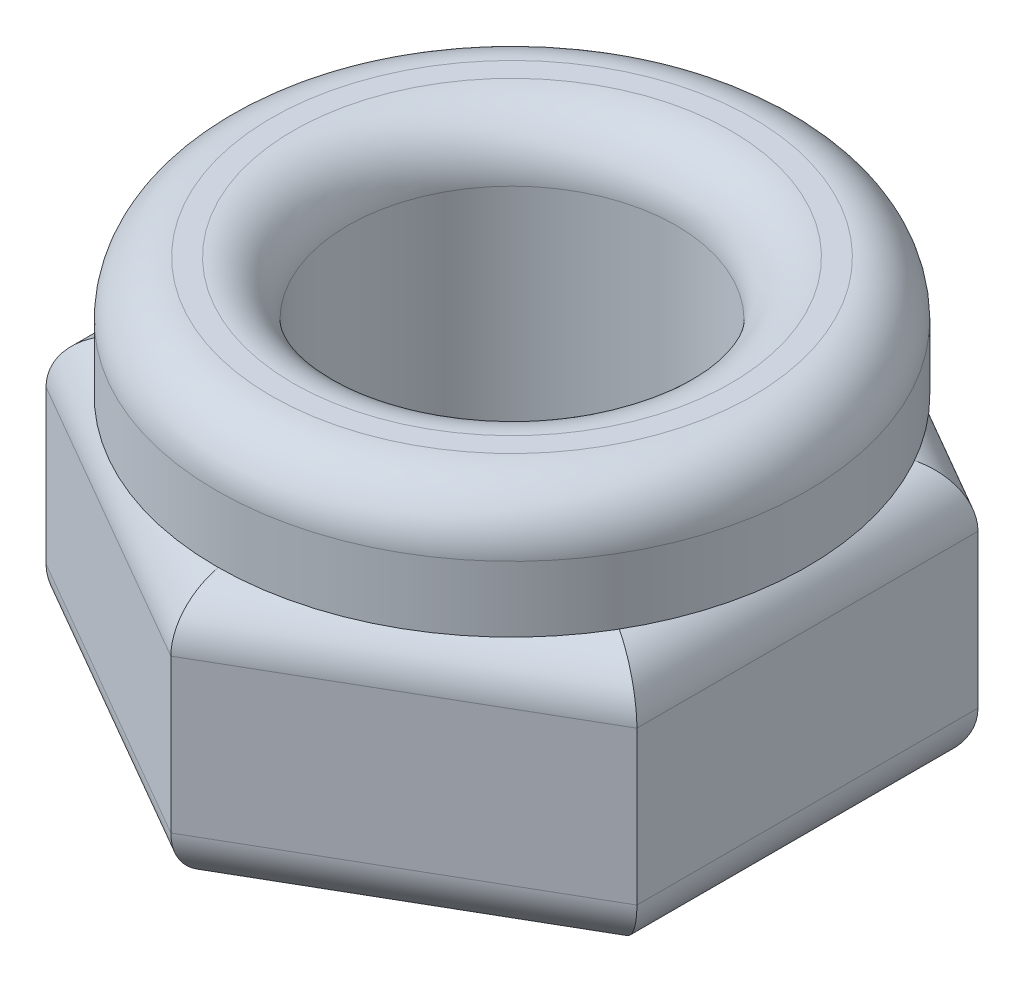
ISO-10303-21;
HEADER;
FILE_DESCRIPTION(('STEP AP214'),'2;1');
FILE_NAME('part.step','',(''),(''),'','','');
FILE_SCHEMA(('AUTOMOTIVE_DESIGN { 1 0 10303 214 1 1 1 1 }'));
ENDSEC;
DATA;
#1=APPLICATION_CONTEXT('core data for automotive mechanical design processes');
#2=APPLICATION_PROTOCOL_DEFINITION('international standard','automotive_design',2000,#1);
#3=PRODUCT_CONTEXT('',#1,'mechanical');
#4=PRODUCT('Part','Part','',(#3));
#5=PRODUCT_RELATED_PRODUCT_CATEGORY('part','',(#4));
#6=PRODUCT_DEFINITION_FORMATION('','',#4);
#7=PRODUCT_DEFINITION_CONTEXT('part definition',#1,'design');
#8=PRODUCT_DEFINITION('design','',#6,#7);
#9=PRODUCT_DEFINITION_SHAPE('','',#8);
#10=(LENGTH_UNIT() NAMED_UNIT(*) SI_UNIT(.MILLI.,.METRE.));
#11=(NAMED_UNIT(*) PLANE_ANGLE_UNIT() SI_UNIT($,.RADIAN.));
#12=(NAMED_UNIT(*) SI_UNIT($,.STERADIAN.) SOLID_ANGLE_UNIT());
#13=UNCERTAINTY_MEASURE_WITH_UNIT(LENGTH_MEASURE(1.E-05),#10,'distance_accuracy_value','');
#14=(GEOMETRIC_REPRESENTATION_CONTEXT(3) GLOBAL_UNCERTAINTY_ASSIGNED_CONTEXT((#13)) GLOBAL_UNIT_ASSIGNED_CONTEXT((#10,
#11,#12)) REPRESENTATION_CONTEXT('',''));
#15=CARTESIAN_POINT('',(0.,0.,0.));
#16=DIRECTION('',(0.,0.,1.));
#17=DIRECTION('',(1.,0.,0.));
#18=AXIS2_PLACEMENT_3D('',#15,#16,#17);
#19=CARTESIAN_POINT('',(2.7,2.4,-1.55884572681199));
#20=DIRECTION('',(-0.5,0.,0.866025403784439));
#21=DIRECTION('',(0.866025403784439,0.,0.5));
#22=AXIS2_PLACEMENT_3D('',#19,#20,#21);
#23=PLANE('',#22);
#24=DIRECTION('',(0.,-1.,0.));
#25=VECTOR('',#24,1.);
#26=CARTESIAN_POINT('',(2.7,2.4,-1.55884572681199));
#27=LINE('',#26,#25);
#28=CARTESIAN_POINT('',(2.7,1.9,-1.55884572681199));
#29=VERTEX_POINT('',#28);
#30=CARTESIAN_POINT('',(2.7,0.5,-1.55884572681199));
#31=VERTEX_POINT('',#30);
#32=EDGE_CURVE('E329',#29,#31,#27,.T.);
#33=ORIENTED_EDGE('',*,*,#32,.T.);
#34=DIRECTION('',(-0.866025403784439,0.,-0.5));
#35=VECTOR('',#34,1.);
#36=CARTESIAN_POINT('',(2.7,0.5,-1.55884572681199));
#37=LINE('',#36,#35);
#38=CARTESIAN_POINT('',(0.,0.5,-3.11769145362398));
#39=VERTEX_POINT('',#38);
#40=EDGE_CURVE('E289',#31,#39,#37,.T.);
#41=ORIENTED_EDGE('',*,*,#40,.T.);
#42=DIRECTION('',(0.,-1.,0.));
#43=VECTOR('',#42,1.);
#44=CARTESIAN_POINT('',(0.,2.4,-3.11769145362398));
#45=LINE('',#44,#43);
#46=CARTESIAN_POINT('',(0.,1.9,-3.11769145362398));
#47=VERTEX_POINT('',#46);
#48=EDGE_CURVE('E319',#47,#39,#45,.T.);
#49=ORIENTED_EDGE('',*,*,#48,.F.);
#50=DIRECTION('',(-0.866025403784439,0.,-0.5));
#51=VECTOR('',#50,1.);
#52=CARTESIAN_POINT('',(2.7,1.9,-1.55884572681199));
#53=LINE('',#52,#51);
#54=EDGE_CURVE('E271',#47,#29,#53,.F.);
#55=ORIENTED_EDGE('',*,*,#54,.T.);
#56=EDGE_LOOP('',(#33,#41,#49,#55));
#57=FACE_BOUND('',#56,.T.);
#58=ADVANCED_FACE('F36',(#57),#23,.F.);
#59=CARTESIAN_POINT('',(0.,2.4,-3.11769145362398));
#60=DIRECTION('',(0.5,0.,0.866025403784439));
#61=DIRECTION('',(0.866025403784439,0.,-0.5));
#62=AXIS2_PLACEMENT_3D('',#59,#60,#61);
#63=PLANE('',#62);
#64=ORIENTED_EDGE('',*,*,#48,.T.);
#65=DIRECTION('',(-0.866025403784439,0.,0.5));
#66=VECTOR('',#65,1.);
#67=CARTESIAN_POINT('',(0.,0.5,-3.11769145362398));
#68=LINE('',#67,#66);
#69=CARTESIAN_POINT('',(-2.7,0.5,-1.55884572681199));
#70=VERTEX_POINT('',#69);
#71=EDGE_CURVE('E293',#39,#70,#68,.T.);
#72=ORIENTED_EDGE('',*,*,#71,.T.);
#73=DIRECTION('',(0.,-1.,0.));
#74=VECTOR('',#73,1.);
#75=CARTESIAN_POINT('',(-2.7,2.4,-1.55884572681199));
#76=LINE('',#75,#74);
#77=CARTESIAN_POINT('',(-2.7,1.9,-1.55884572681199));
#78=VERTEX_POINT('',#77);
#79=EDGE_CURVE('E317',#78,#70,#76,.T.);
#80=ORIENTED_EDGE('',*,*,#79,.F.);
#81=DIRECTION('',(-0.866025403784439,0.,0.5));
#82=VECTOR('',#81,1.);
#83=CARTESIAN_POINT('',(0.,1.9,-3.11769145362398));
#84=LINE('',#83,#82);
#85=EDGE_CURVE('E291',#78,#47,#84,.F.);
#86=ORIENTED_EDGE('',*,*,#85,.T.);
#87=EDGE_LOOP('',(#64,#72,#80,#86));
#88=FACE_BOUND('',#87,.T.);
#89=ADVANCED_FACE('F213',(#88),#63,.F.);
#90=CARTESIAN_POINT('',(-2.7,2.4,-1.55884572681199));
#91=DIRECTION('',(1.,0.,0.));
#92=DIRECTION('',(0.,0.,-1.));
#93=AXIS2_PLACEMENT_3D('',#90,#91,#92);
#94=PLANE('',#93);
#95=ORIENTED_EDGE('',*,*,#79,.T.);
#96=DIRECTION('',(0.,0.,1.));
#97=VECTOR('',#96,1.);
#98=CARTESIAN_POINT('',(-2.7,0.5,-1.55884572681199));
#99=LINE('',#98,#97);
#100=CARTESIAN_POINT('',(-2.7,0.5,1.55884572681199));
#101=VERTEX_POINT('',#100);
#102=EDGE_CURVE('E297',#70,#101,#99,.T.);
#103=ORIENTED_EDGE('',*,*,#102,.T.);
#104=DIRECTION('',(0.,-1.,0.));
#105=VECTOR('',#104,1.);
#106=CARTESIAN_POINT('',(-2.7,2.4,1.55884572681199));
#107=LINE('',#106,#105);
#108=CARTESIAN_POINT('',(-2.7,1.9,1.55884572681199));
#109=VERTEX_POINT('',#108);
#110=EDGE_CURVE('E312',#109,#101,#107,.T.);
#111=ORIENTED_EDGE('',*,*,#110,.F.);
#112=DIRECTION('',(0.,0.,1.));
#113=VECTOR('',#112,1.);
#114=CARTESIAN_POINT('',(-2.7,1.9,-1.55884572681199));
#115=LINE('',#114,#113);
#116=EDGE_CURVE('E295',#109,#78,#115,.F.);
#117=ORIENTED_EDGE('',*,*,#116,.T.);
#118=EDGE_LOOP('',(#95,#103,#111,#117));
#119=FACE_BOUND('',#118,.T.);
#120=ADVANCED_FACE('F219',(#119),#94,.F.);
#121=CARTESIAN_POINT('',(-2.7,2.4,1.55884572681199));
#122=DIRECTION('',(0.5,0.,-0.866025403784439));
#123=DIRECTION('',(-0.866025403784439,0.,-0.5));
#124=AXIS2_PLACEMENT_3D('',#121,#122,#123);
#125=PLANE('',#124);
#126=ORIENTED_EDGE('',*,*,#110,.T.);
#127=DIRECTION('',(0.866025403784439,0.,0.5));
#128=VECTOR('',#127,1.);
#129=CARTESIAN_POINT('',(-2.7,0.5,1.55884572681199));
#130=LINE('',#129,#128);
#131=CARTESIAN_POINT('',(0.,0.5,3.11769145362398));
#132=VERTEX_POINT('',#131);
#133=EDGE_CURVE('E139',#101,#132,#130,.T.);
#134=ORIENTED_EDGE('',*,*,#133,.T.);
#135=DIRECTION('',(0.,-1.,0.));
#136=VECTOR('',#135,1.);
#137=CARTESIAN_POINT('',(0.,2.4,3.11769145362398));
#138=LINE('',#137,#136);
#139=CARTESIAN_POINT('',(0.,1.9,3.11769145362398));
#140=VERTEX_POINT('',#139);
#141=EDGE_CURVE('E315',#140,#132,#138,.T.);
#142=ORIENTED_EDGE('',*,*,#141,.F.);
#143=DIRECTION('',(0.866025403784439,0.,0.5));
#144=VECTOR('',#143,1.);
#145=CARTESIAN_POINT('',(-2.7,1.9,1.55884572681199));
#146=LINE('',#145,#144);
#147=EDGE_CURVE('E147',#140,#109,#146,.F.);
#148=ORIENTED_EDGE('',*,*,#147,.T.);
#149=EDGE_LOOP('',(#126,#134,#142,#148));
#150=FACE_BOUND('',#149,.T.);
#151=ADVANCED_FACE('F311',(#150),#125,.F.);
#152=CARTESIAN_POINT('',(0.,2.4,3.11769145362398));
#153=DIRECTION('',(-0.5,0.,-0.866025403784439));
#154=DIRECTION('',(-0.866025403784439,0.,0.5));
#155=AXIS2_PLACEMENT_3D('',#152,#153,#154);
#156=PLANE('',#155);
#157=ORIENTED_EDGE('',*,*,#141,.T.);
#158=DIRECTION('',(0.866025403784439,0.,-0.5));
#159=VECTOR('',#158,1.);
#160=CARTESIAN_POINT('',(0.,0.5,3.11769145362398));
#161=LINE('',#160,#159);
#162=CARTESIAN_POINT('',(2.7,0.5,1.55884572681199));
#163=VERTEX_POINT('',#162);
#164=EDGE_CURVE('E331',#132,#163,#161,.T.);
#165=ORIENTED_EDGE('',*,*,#164,.T.);
#166=DIRECTION('',(0.,-1.,0.));
#167=VECTOR('',#166,1.);
#168=CARTESIAN_POINT('',(2.7,2.4,1.55884572681199));
#169=LINE('',#168,#167);
#170=CARTESIAN_POINT('',(2.7,1.9,1.55884572681199));
#171=VERTEX_POINT('',#170);
#172=EDGE_CURVE('E321',#171,#163,#169,.T.);
#173=ORIENTED_EDGE('',*,*,#172,.F.);
#174=DIRECTION('',(0.866025403784439,0.,-0.5));
#175=VECTOR('',#174,1.);
#176=CARTESIAN_POINT('',(0.,1.9,3.11769145362398));
#177=LINE('',#176,#175);
#178=EDGE_CURVE('E326',#171,#140,#177,.F.);
#179=ORIENTED_EDGE('',*,*,#178,.T.);
#180=EDGE_LOOP('',(#157,#165,#173,#179));
#181=FACE_BOUND('',#180,.T.);
#182=ADVANCED_FACE('F354',(#181),#156,.F.);
#183=CARTESIAN_POINT('',(2.7,2.4,1.55884572681199));
#184=DIRECTION('',(-1.,0.,0.));
#185=DIRECTION('',(0.,0.,1.));
#186=AXIS2_PLACEMENT_3D('',#183,#184,#185);
#187=PLANE('',#186);
#188=ORIENTED_EDGE('',*,*,#172,.T.);
#189=DIRECTION('',(0.,0.,-1.));
#190=VECTOR('',#189,1.);
#191=CARTESIAN_POINT('',(2.7,0.5,1.55884572681199));
#192=LINE('',#191,#190);
#193=EDGE_CURVE('E279',#163,#31,#192,.T.);
#194=ORIENTED_EDGE('',*,*,#193,.T.);
#195=ORIENTED_EDGE('',*,*,#32,.F.);
#196=DIRECTION('',(0.,0.,-1.));
#197=VECTOR('',#196,1.);
#198=CARTESIAN_POINT('',(2.7,1.9,1.55884572681199));
#199=LINE('',#198,#197);
#200=EDGE_CURVE('E274',#29,#171,#199,.F.);
#201=ORIENTED_EDGE('',*,*,#200,.T.);
#202=EDGE_LOOP('',(#188,#194,#195,#201));
#203=FACE_BOUND('',#202,.T.);
#204=ADVANCED_FACE('F355',(#203),#187,.F.);
#205=CARTESIAN_POINT('',(0.,0.,0.));
#206=DIRECTION('',(0.,1.,0.));
#207=DIRECTION('',(0.,0.,1.));
#208=AXIS2_PLACEMENT_3D('',#205,#206,#207);
#209=PLANE('',#208);
#210=DIRECTION('',(0.,0.,-1.));
#211=VECTOR('',#210,1.);
#212=CARTESIAN_POINT('',(2.2,0.,0.));
#213=LINE('',#212,#211);
#214=CARTESIAN_POINT('',(2.2,0.,-1.27017059221718));
#215=VERTEX_POINT('',#214);
#216=CARTESIAN_POINT('',(2.2,0.,1.27017059221718));
#217=VERTEX_POINT('',#216);
#218=EDGE_CURVE('E284',#215,#217,#213,.F.);
#219=ORIENTED_EDGE('',*,*,#218,.T.);
#220=DIRECTION('',(0.866025403784439,0.,-0.5));
#221=VECTOR('',#220,1.);
#222=CARTESIAN_POINT('',(1.1,0.,1.90525588832577));
#223=LINE('',#222,#221);
#224=CARTESIAN_POINT('',(0.,0.,2.54034118443435));
#225=VERTEX_POINT('',#224);
#226=EDGE_CURVE('E280',#217,#225,#223,.F.);
#227=ORIENTED_EDGE('',*,*,#226,.T.);
#228=DIRECTION('',(0.866025403784439,0.,0.5));
#229=VECTOR('',#228,1.);
#230=CARTESIAN_POINT('',(-1.1,0.,1.90525588832577));
#231=LINE('',#230,#229);
#232=CARTESIAN_POINT('',(-2.2,0.,1.27017059221718));
#233=VERTEX_POINT('',#232);
#234=EDGE_CURVE('E334',#225,#233,#231,.F.);
#235=ORIENTED_EDGE('',*,*,#234,.T.);
#236=DIRECTION('',(0.,0.,1.));
#237=VECTOR('',#236,1.);
#238=CARTESIAN_POINT('',(-2.2,0.,0.));
#239=LINE('',#238,#237);
#240=CARTESIAN_POINT('',(-2.2,0.,-1.27017059221718));
#241=VERTEX_POINT('',#240);
#242=EDGE_CURVE('E336',#233,#241,#239,.F.);
#243=ORIENTED_EDGE('',*,*,#242,.T.);
#244=DIRECTION('',(-0.866025403784439,0.,0.5));
#245=VECTOR('',#244,1.);
#246=CARTESIAN_POINT('',(-1.1,0.,-1.90525588832577));
#247=LINE('',#246,#245);
#248=CARTESIAN_POINT('',(0.,0.,-2.54034118443435));
#249=VERTEX_POINT('',#248);
#250=EDGE_CURVE('E338',#241,#249,#247,.F.);
#251=ORIENTED_EDGE('',*,*,#250,.T.);
#252=DIRECTION('',(-0.866025403784439,0.,-0.5));
#253=VECTOR('',#252,1.);
#254=CARTESIAN_POINT('',(1.1,0.,-1.90525588832577));
#255=LINE('',#254,#253);
#256=EDGE_CURVE('E340',#249,#215,#255,.F.);
#257=ORIENTED_EDGE('',*,*,#256,.T.);
#258=EDGE_LOOP('',(#219,#227,#235,#243,#251,#257));
#259=FACE_BOUND('',#258,.T.);
#260=CARTESIAN_POINT('',(0.,0.,0.));
#261=DIRECTION('',(0.,1.,0.));
#262=DIRECTION('',(0.,0.,1.));
#263=AXIS2_PLACEMENT_3D('',#260,#261,#262);
#264=CIRCLE('',#263,1.5);
#265=CARTESIAN_POINT('',(0.,0.,1.5));
#266=VERTEX_POINT('',#265);
#267=EDGE_CURVE('E178',#266,#266,#264,.T.);
#268=ORIENTED_EDGE('',*,*,#267,.T.);
#269=EDGE_LOOP('',(#268));
#270=FACE_BOUND('',#269,.T.);
#271=ADVANCED_FACE('F344',(#259,#270),#209,.F.);
#272=CARTESIAN_POINT('',(0.,-7.6,0.));
#273=DIRECTION('',(0.,1.,0.));
#274=DIRECTION('',(0.,0.,1.));
#275=AXIS2_PLACEMENT_3D('',#272,#273,#274);
#276=CYLINDRICAL_SURFACE('',#275,1.5);
#277=CARTESIAN_POINT('',(0.,3.,0.));
#278=DIRECTION('',(0.,1.,0.));
#279=DIRECTION('',(0.,0.,1.));
#280=AXIS2_PLACEMENT_3D('',#277,#278,#279);
#281=CIRCLE('',#280,1.5);
#282=CARTESIAN_POINT('',(0.,3.,1.5));
#283=VERTEX_POINT('',#282);
#284=EDGE_CURVE('E44',#283,#283,#281,.T.);
#285=ORIENTED_EDGE('',*,*,#284,.T.);
#286=EDGE_LOOP('',(#285));
#287=FACE_BOUND('',#286,.T.);
#288=ORIENTED_EDGE('',*,*,#267,.F.);
#289=EDGE_LOOP('',(#288));
#290=FACE_BOUND('',#289,.T.);
#291=ADVANCED_FACE('F192',(#287,#290),#276,.F.);
#292=CARTESIAN_POINT('',(0.25,0.5,-2.68467875173176));
#293=DIRECTION('',(-0.866025403784439,0.,0.5));
#294=DIRECTION('',(0.5,0.,0.866025403784439));
#295=AXIS2_PLACEMENT_3D('',#292,#293,#294);
#296=CYLINDRICAL_SURFACE('',#295,0.5);
#297=CARTESIAN_POINT('',(0.,0.5,-2.54034118443435));
#298=DIRECTION('',(-1.,0.,0.));
#299=DIRECTION('',(0.,0.,1.));
#300=AXIS2_PLACEMENT_3D('',#297,#298,#299);
#301=ELLIPSE('',#300,0.577350269189626,0.5);
#302=EDGE_CURVE('E173',#249,#39,#301,.F.);
#303=ORIENTED_EDGE('',*,*,#302,.F.);
#304=ORIENTED_EDGE('',*,*,#250,.F.);
#305=CARTESIAN_POINT('',(-2.2,0.5,-1.27017059221718));
#306=DIRECTION('',(-0.5,0.,0.866025403784439));
#307=DIRECTION('',(0.866025403784439,0.,0.5));
#308=AXIS2_PLACEMENT_3D('',#305,#306,#307);
#309=ELLIPSE('',#308,0.577350269189626,0.5);
#310=EDGE_CURVE('E176',#70,#241,#309,.T.);
#311=ORIENTED_EDGE('',*,*,#310,.F.);
#312=ORIENTED_EDGE('',*,*,#71,.F.);
#313=EDGE_LOOP('',(#303,#304,#311,#312));
#314=FACE_BOUND('',#313,.T.);
#315=ADVANCED_FACE('F245',(#314),#296,.T.);
#316=CARTESIAN_POINT('',(-2.2,0.5,-1.55884572681199));
#317=DIRECTION('',(0.,0.,1.));
#318=DIRECTION('',(1.,0.,0.));
#319=AXIS2_PLACEMENT_3D('',#316,#317,#318);
#320=CYLINDRICAL_SURFACE('',#319,0.5);
#321=ORIENTED_EDGE('',*,*,#310,.T.);
#322=ORIENTED_EDGE('',*,*,#242,.F.);
#323=CARTESIAN_POINT('',(-2.2,0.5,1.27017059221718));
#324=DIRECTION('',(0.5,0.,0.866025403784438));
#325=DIRECTION('',(0.866025403784439,0.,-0.5));
#326=AXIS2_PLACEMENT_3D('',#323,#324,#325);
#327=ELLIPSE('',#326,0.577350269189626,0.5);
#328=EDGE_CURVE('E170',#101,#233,#327,.T.);
#329=ORIENTED_EDGE('',*,*,#328,.F.);
#330=ORIENTED_EDGE('',*,*,#102,.F.);
#331=EDGE_LOOP('',(#321,#322,#329,#330));
#332=FACE_BOUND('',#331,.T.);
#333=ADVANCED_FACE('F241',(#332),#320,.T.);
#334=CARTESIAN_POINT('',(2.45,0.5,-1.12583302491977));
#335=DIRECTION('',(-0.866025403784439,0.,-0.5));
#336=DIRECTION('',(-0.5,0.,0.866025403784439));
#337=AXIS2_PLACEMENT_3D('',#334,#335,#336);
#338=CYLINDRICAL_SURFACE('',#337,0.5);
#339=ORIENTED_EDGE('',*,*,#302,.T.);
#340=ORIENTED_EDGE('',*,*,#40,.F.);
#341=CARTESIAN_POINT('',(2.2,0.5,-1.27017059221718));
#342=DIRECTION('',(-0.5,0.,-0.866025403784438));
#343=DIRECTION('',(-0.866025403784439,0.,0.5));
#344=AXIS2_PLACEMENT_3D('',#341,#342,#343);
#345=ELLIPSE('',#344,0.577350269189626,0.5);
#346=EDGE_CURVE('E167',#215,#31,#345,.F.);
#347=ORIENTED_EDGE('',*,*,#346,.F.);
#348=ORIENTED_EDGE('',*,*,#256,.F.);
#349=EDGE_LOOP('',(#339,#340,#347,#348));
#350=FACE_BOUND('',#349,.T.);
#351=ADVANCED_FACE('F237',(#350),#338,.T.);
#352=CARTESIAN_POINT('',(-2.45,0.5,1.12583302491977));
#353=DIRECTION('',(0.866025403784439,0.,0.5));
#354=DIRECTION('',(0.5,0.,-0.866025403784439));
#355=AXIS2_PLACEMENT_3D('',#352,#353,#354);
#356=CYLINDRICAL_SURFACE('',#355,0.5);
#357=ORIENTED_EDGE('',*,*,#328,.T.);
#358=ORIENTED_EDGE('',*,*,#234,.F.);
#359=CARTESIAN_POINT('',(0.,0.5,2.54034118443435));
#360=DIRECTION('',(1.,0.,0.));
#361=DIRECTION('',(0.,0.,1.));
#362=AXIS2_PLACEMENT_3D('',#359,#360,#361);
#363=ELLIPSE('',#362,0.577350269189626,0.5);
#364=EDGE_CURVE('E164',#132,#225,#363,.T.);
#365=ORIENTED_EDGE('',*,*,#364,.F.);
#366=ORIENTED_EDGE('',*,*,#133,.F.);
#367=EDGE_LOOP('',(#357,#358,#365,#366));
#368=FACE_BOUND('',#367,.T.);
#369=ADVANCED_FACE('F233',(#368),#356,.T.);
#370=CARTESIAN_POINT('',(2.2,0.5,1.55884572681199));
#371=DIRECTION('',(0.,0.,-1.));
#372=DIRECTION('',(-1.,0.,0.));
#373=AXIS2_PLACEMENT_3D('',#370,#371,#372);
#374=CYLINDRICAL_SURFACE('',#373,0.5);
#375=ORIENTED_EDGE('',*,*,#346,.T.);
#376=ORIENTED_EDGE('',*,*,#193,.F.);
#377=CARTESIAN_POINT('',(2.2,0.5,1.27017059221718));
#378=DIRECTION('',(0.5,0.,-0.866025403784439));
#379=DIRECTION('',(-0.866025403784439,0.,-0.5));
#380=AXIS2_PLACEMENT_3D('',#377,#378,#379);
#381=ELLIPSE('',#380,0.577350269189626,0.5);
#382=EDGE_CURVE('E162',#217,#163,#381,.F.);
#383=ORIENTED_EDGE('',*,*,#382,.F.);
#384=ORIENTED_EDGE('',*,*,#218,.F.);
#385=EDGE_LOOP('',(#375,#376,#383,#384));
#386=FACE_BOUND('',#385,.T.);
#387=ADVANCED_FACE('F229',(#386),#374,.T.);
#388=CARTESIAN_POINT('',(-0.25,0.5,2.68467875173176));
#389=DIRECTION('',(0.866025403784439,0.,-0.5));
#390=DIRECTION('',(-0.5,0.,-0.866025403784439));
#391=AXIS2_PLACEMENT_3D('',#388,#389,#390);
#392=CYLINDRICAL_SURFACE('',#391,0.5);
#393=ORIENTED_EDGE('',*,*,#364,.T.);
#394=ORIENTED_EDGE('',*,*,#226,.F.);
#395=ORIENTED_EDGE('',*,*,#382,.T.);
#396=ORIENTED_EDGE('',*,*,#164,.F.);
#397=EDGE_LOOP('',(#393,#394,#395,#396));
#398=FACE_BOUND('',#397,.T.);
#399=ADVANCED_FACE('F225',(#398),#392,.T.);
#400=CARTESIAN_POINT('',(1.1,1.9,-1.90525588832577));
#401=DIRECTION('',(0.866025403784439,0.,0.5));
#402=DIRECTION('',(0.5,0.,-0.866025403784439));
#403=AXIS2_PLACEMENT_3D('',#400,#401,#402);
#404=CYLINDRICAL_SURFACE('',#403,0.5);
#405=CARTESIAN_POINT('',(2.2,1.9,-1.27017059221718));
#406=DIRECTION('',(0.5,0.,0.866025403784438));
#407=DIRECTION('',(-0.866025403784439,0.,0.5));
#408=AXIS2_PLACEMENT_3D('',#405,#406,#407);
#409=ELLIPSE('',#408,0.577350269189626,0.5);
#410=CARTESIAN_POINT('',(2.2,2.4,-1.27017059221718));
#411=VERTEX_POINT('',#410);
#412=EDGE_CURVE('E183',#29,#411,#409,.T.);
#413=ORIENTED_EDGE('',*,*,#412,.F.);
#414=ORIENTED_EDGE('',*,*,#54,.F.);
#415=CARTESIAN_POINT('',(0.,1.9,-2.54034118443435));
#416=DIRECTION('',(1.,0.,0.));
#417=DIRECTION('',(0.,0.,1.));
#418=AXIS2_PLACEMENT_3D('',#415,#416,#417);
#419=ELLIPSE('',#418,0.577350269189626,0.5);
#420=CARTESIAN_POINT('',(0.,2.4,-2.54034118443435));
#421=VERTEX_POINT('',#420);
#422=EDGE_CURVE('E165',#421,#47,#419,.F.);
#423=ORIENTED_EDGE('',*,*,#422,.F.);
#424=DIRECTION('',(-0.866025403784439,0.,-0.5));
#425=VECTOR('',#424,1.);
#426=CARTESIAN_POINT('',(-0.25,2.4,-2.68467875173176));
#427=LINE('',#426,#425);
#428=EDGE_CURVE('E273',#411,#421,#427,.T.);
#429=ORIENTED_EDGE('',*,*,#428,.F.);
#430=EDGE_LOOP('',(#413,#414,#423,#429));
#431=FACE_BOUND('',#430,.T.);
#432=ADVANCED_FACE('F228',(#431),#404,.T.);
#433=CARTESIAN_POINT('',(-1.1,1.9,-1.90525588832577));
#434=DIRECTION('',(0.866025403784439,0.,-0.5));
#435=DIRECTION('',(-0.5,0.,-0.866025403784439));
#436=AXIS2_PLACEMENT_3D('',#433,#434,#435);
#437=CYLINDRICAL_SURFACE('',#436,0.5);
#438=ORIENTED_EDGE('',*,*,#422,.T.);
#439=ORIENTED_EDGE('',*,*,#85,.F.);
#440=CARTESIAN_POINT('',(-2.2,1.9,-1.27017059221718));
#441=DIRECTION('',(0.5,0.,-0.866025403784439));
#442=DIRECTION('',(0.866025403784439,0.,0.5));
#443=AXIS2_PLACEMENT_3D('',#440,#441,#442);
#444=ELLIPSE('',#443,0.577350269189626,0.5);
#445=CARTESIAN_POINT('',(-2.2,2.4,-1.27017059221718));
#446=VERTEX_POINT('',#445);
#447=EDGE_CURVE('E59',#446,#78,#444,.F.);
#448=ORIENTED_EDGE('',*,*,#447,.F.);
#449=DIRECTION('',(-0.866025403784439,0.,0.5));
#450=VECTOR('',#449,1.);
#451=CARTESIAN_POINT('',(-2.45,2.4,-1.12583302491977));
#452=LINE('',#451,#450);
#453=EDGE_CURVE('E158',#421,#446,#452,.T.);
#454=ORIENTED_EDGE('',*,*,#453,.F.);
#455=EDGE_LOOP('',(#438,#439,#448,#454));
#456=FACE_BOUND('',#455,.T.);
#457=ADVANCED_FACE('F260',(#456),#437,.T.);
#458=CARTESIAN_POINT('',(2.2,1.9,0.));
#459=DIRECTION('',(0.,0.,1.));
#460=DIRECTION('',(1.,0.,0.));
#461=AXIS2_PLACEMENT_3D('',#458,#459,#460);
#462=CYLINDRICAL_SURFACE('',#461,0.5);
#463=ORIENTED_EDGE('',*,*,#412,.T.);
#464=DIRECTION('',(0.,0.,-1.));
#465=VECTOR('',#464,1.);
#466=CARTESIAN_POINT('',(2.2,2.4,-1.55884572681199));
#467=LINE('',#466,#465);
#468=CARTESIAN_POINT('',(2.2,2.4,1.27017059221718));
#469=VERTEX_POINT('',#468);
#470=EDGE_CURVE('E138',#469,#411,#467,.T.);
#471=ORIENTED_EDGE('',*,*,#470,.F.);
#472=CARTESIAN_POINT('',(2.2,1.9,1.27017059221718));
#473=DIRECTION('',(-0.5,0.,0.866025403784439));
#474=DIRECTION('',(-0.866025403784439,0.,-0.5));
#475=AXIS2_PLACEMENT_3D('',#472,#473,#474);
#476=ELLIPSE('',#475,0.577350269189626,0.5);
#477=EDGE_CURVE('E134',#171,#469,#476,.T.);
#478=ORIENTED_EDGE('',*,*,#477,.F.);
#479=ORIENTED_EDGE('',*,*,#200,.F.);
#480=EDGE_LOOP('',(#463,#471,#478,#479));
#481=FACE_BOUND('',#480,.T.);
#482=ADVANCED_FACE('F257',(#481),#462,.T.);
#483=CARTESIAN_POINT('',(-2.2,1.9,0.));
#484=DIRECTION('',(0.,0.,-1.));
#485=DIRECTION('',(-1.,0.,0.));
#486=AXIS2_PLACEMENT_3D('',#483,#484,#485);
#487=CYLINDRICAL_SURFACE('',#486,0.5);
#488=ORIENTED_EDGE('',*,*,#447,.T.);
#489=ORIENTED_EDGE('',*,*,#116,.F.);
#490=CARTESIAN_POINT('',(-2.2,1.9,1.27017059221718));
#491=DIRECTION('',(-0.5,0.,-0.866025403784438));
#492=DIRECTION('',(0.866025403784439,0.,-0.5));
#493=AXIS2_PLACEMENT_3D('',#490,#491,#492);
#494=ELLIPSE('',#493,0.577350269189626,0.5);
#495=CARTESIAN_POINT('',(-2.2,2.4,1.27017059221718));
#496=VERTEX_POINT('',#495);
#497=EDGE_CURVE('E51',#496,#109,#494,.F.);
#498=ORIENTED_EDGE('',*,*,#497,.F.);
#499=DIRECTION('',(0.,0.,1.));
#500=VECTOR('',#499,1.);
#501=CARTESIAN_POINT('',(-2.2,2.4,1.55884572681199));
#502=LINE('',#501,#500);
#503=EDGE_CURVE('E152',#446,#496,#502,.T.);
#504=ORIENTED_EDGE('',*,*,#503,.F.);
#505=EDGE_LOOP('',(#488,#489,#498,#504));
#506=FACE_BOUND('',#505,.T.);
#507=ADVANCED_FACE('F254',(#506),#487,.T.);
#508=CARTESIAN_POINT('',(1.1,1.9,1.90525588832577));
#509=DIRECTION('',(-0.866025403784439,0.,0.5));
#510=DIRECTION('',(0.5,0.,0.866025403784439));
#511=AXIS2_PLACEMENT_3D('',#508,#509,#510);
#512=CYLINDRICAL_SURFACE('',#511,0.5);
#513=ORIENTED_EDGE('',*,*,#477,.T.);
#514=DIRECTION('',(0.866025403784439,0.,-0.5));
#515=VECTOR('',#514,1.);
#516=CARTESIAN_POINT('',(2.45,2.4,1.12583302491977));
#517=LINE('',#516,#515);
#518=CARTESIAN_POINT('',(0.,2.4,2.54034118443435));
#519=VERTEX_POINT('',#518);
#520=EDGE_CURVE('E128',#519,#469,#517,.T.);
#521=ORIENTED_EDGE('',*,*,#520,.F.);
#522=CARTESIAN_POINT('',(0.,1.9,2.54034118443435));
#523=DIRECTION('',(-1.,0.,0.));
#524=DIRECTION('',(0.,0.,1.));
#525=AXIS2_PLACEMENT_3D('',#522,#523,#524);
#526=ELLIPSE('',#525,0.577350269189626,0.5);
#527=EDGE_CURVE('E132',#140,#519,#526,.T.);
#528=ORIENTED_EDGE('',*,*,#527,.F.);
#529=ORIENTED_EDGE('',*,*,#178,.F.);
#530=EDGE_LOOP('',(#513,#521,#528,#529));
#531=FACE_BOUND('',#530,.T.);
#532=ADVANCED_FACE('F130',(#531),#512,.T.);
#533=CARTESIAN_POINT('',(-1.1,1.9,1.90525588832577));
#534=DIRECTION('',(-0.866025403784439,0.,-0.5));
#535=DIRECTION('',(-0.5,0.,0.866025403784439));
#536=AXIS2_PLACEMENT_3D('',#533,#534,#535);
#537=CYLINDRICAL_SURFACE('',#536,0.5);
#538=ORIENTED_EDGE('',*,*,#497,.T.);
#539=ORIENTED_EDGE('',*,*,#147,.F.);
#540=ORIENTED_EDGE('',*,*,#527,.T.);
#541=DIRECTION('',(0.866025403784439,0.,0.5));
#542=VECTOR('',#541,1.);
#543=CARTESIAN_POINT('',(0.25,2.4,2.68467875173176));
#544=LINE('',#543,#542);
#545=EDGE_CURVE('E144',#496,#519,#544,.T.);
#546=ORIENTED_EDGE('',*,*,#545,.F.);
#547=EDGE_LOOP('',(#538,#539,#540,#546));
#548=FACE_BOUND('',#547,.T.);
#549=ADVANCED_FACE('F143',(#548),#537,.T.);
#550=CARTESIAN_POINT('',(0.,2.4,0.));
#551=DIRECTION('',(0.,1.,0.));
#552=DIRECTION('',(0.,0.,1.));
#553=AXIS2_PLACEMENT_3D('',#550,#551,#552);
#554=PLANE('',#553);
#555=CARTESIAN_POINT('',(0.,2.4,0.));
#556=DIRECTION('',(0.,1.,0.));
#557=DIRECTION('',(0.,0.,1.));
#558=AXIS2_PLACEMENT_3D('',#555,#556,#557);
#559=CIRCLE('',#558,2.7);
#560=CARTESIAN_POINT('',(0.,2.4,2.7));
#561=VERTEX_POINT('',#560);
#562=EDGE_CURVE('E148',#561,#561,#559,.T.);
#563=ORIENTED_EDGE('',*,*,#562,.F.);
#564=EDGE_LOOP('',(#563));
#565=FACE_BOUND('',#564,.T.);
#566=ORIENTED_EDGE('',*,*,#470,.T.);
#567=ORIENTED_EDGE('',*,*,#428,.T.);
#568=ORIENTED_EDGE('',*,*,#453,.T.);
#569=ORIENTED_EDGE('',*,*,#503,.T.);
#570=ORIENTED_EDGE('',*,*,#545,.T.);
#571=ORIENTED_EDGE('',*,*,#520,.T.);
#572=EDGE_LOOP('',(#566,#567,#568,#569,#570,#571));
#573=FACE_BOUND('',#572,.T.);
#574=ADVANCED_FACE('F150',(#565,#573),#554,.F.);
#575=CARTESIAN_POINT('',(0.,3.5,0.));
#576=DIRECTION('',(0.,-1.,0.));
#577=DIRECTION('',(0.,0.,-1.));
#578=AXIS2_PLACEMENT_3D('',#575,#576,#577);
#579=CYLINDRICAL_SURFACE('',#578,2.7);
#580=CARTESIAN_POINT('',(0.,3.,0.));
#581=DIRECTION('',(0.,1.,0.));
#582=DIRECTION('',(0.,0.,1.));
#583=AXIS2_PLACEMENT_3D('',#580,#581,#582);
#584=CIRCLE('',#583,2.7);
#585=CARTESIAN_POINT('',(0.,3.,2.7));
#586=VERTEX_POINT('',#585);
#587=EDGE_CURVE('E11',#586,#586,#584,.F.);
#588=ORIENTED_EDGE('',*,*,#587,.T.);
#589=EDGE_LOOP('',(#588));
#590=FACE_BOUND('',#589,.T.);
#591=ORIENTED_EDGE('',*,*,#562,.T.);
#592=EDGE_LOOP('',(#591));
#593=FACE_BOUND('',#592,.T.);
#594=ADVANCED_FACE('F203',(#590,#593),#579,.T.);
#595=CARTESIAN_POINT('',(0.,3.5,0.));
#596=DIRECTION('',(0.,1.,0.));
#597=DIRECTION('',(0.,0.,1.));
#598=AXIS2_PLACEMENT_3D('',#595,#596,#597);
#599=PLANE('',#598);
#600=CARTESIAN_POINT('',(0.,3.5,0.));
#601=DIRECTION('',(0.,1.,0.));
#602=DIRECTION('',(0.,0.,1.));
#603=AXIS2_PLACEMENT_3D('',#600,#601,#602);
#604=CIRCLE('',#603,2.);
#605=CARTESIAN_POINT('',(0.,3.5,2.));
#606=VERTEX_POINT('',#605);
#607=EDGE_CURVE('E156',#606,#606,#604,.F.);
#608=ORIENTED_EDGE('',*,*,#607,.T.);
#609=EDGE_LOOP('',(#608));
#610=FACE_BOUND('',#609,.T.);
#611=CARTESIAN_POINT('',(0.,3.5,0.));
#612=DIRECTION('',(0.,1.,0.));
#613=DIRECTION('',(0.,0.,1.));
#614=AXIS2_PLACEMENT_3D('',#611,#612,#613);
#615=CIRCLE('',#614,2.2);
#616=CARTESIAN_POINT('',(0.,3.5,2.2));
#617=VERTEX_POINT('',#616);
#618=EDGE_CURVE('E153',#617,#617,#615,.T.);
#619=ORIENTED_EDGE('',*,*,#618,.T.);
#620=EDGE_LOOP('',(#619));
#621=FACE_BOUND('',#620,.T.);
#622=ADVANCED_FACE('F198',(#610,#621),#599,.T.);
#623=CARTESIAN_POINT('',(0.,3.,0.));
#624=DIRECTION('',(0.,1.,0.));
#625=DIRECTION('',(0.,0.,1.));
#626=AXIS2_PLACEMENT_3D('',#623,#624,#625);
#627=TOROIDAL_SURFACE('',#626,2.,0.5);
#628=ORIENTED_EDGE('',*,*,#284,.F.);
#629=EDGE_LOOP('',(#628));
#630=FACE_BOUND('',#629,.T.);
#631=ORIENTED_EDGE('',*,*,#607,.F.);
#632=EDGE_LOOP('',(#631));
#633=FACE_BOUND('',#632,.T.);
#634=ADVANCED_FACE('F195',(#630,#633),#627,.T.);
#635=CARTESIAN_POINT('',(0.,3.,0.));
#636=DIRECTION('',(0.,1.,0.));
#637=DIRECTION('',(0.,0.,1.));
#638=AXIS2_PLACEMENT_3D('',#635,#636,#637);
#639=TOROIDAL_SURFACE('',#638,2.2,0.5);
#640=ORIENTED_EDGE('',*,*,#587,.F.);
#641=EDGE_LOOP('',(#640));
#642=FACE_BOUND('',#641,.T.);
#643=ORIENTED_EDGE('',*,*,#618,.F.);
#644=EDGE_LOOP('',(#643));
#645=FACE_BOUND('',#644,.T.);
#646=ADVANCED_FACE('F38',(#642,#645),#639,.T.);
#647=CLOSED_SHELL('',(#58,#89,#120,#151,#182,#204,#271,#291,#315,#333,#351,#369,#387,#399,#432,
#457,#482,#507,#532,#549,#574,#594,#622,#634,#646));
#648=MANIFOLD_SOLID_BREP('B2',#647);
#649=ADVANCED_BREP_SHAPE_REPRESENTATION('',(#18,#648),#14);
#650=SHAPE_DEFINITION_REPRESENTATION(#9,#649);
ENDSEC;
END-ISO-10303-21;
